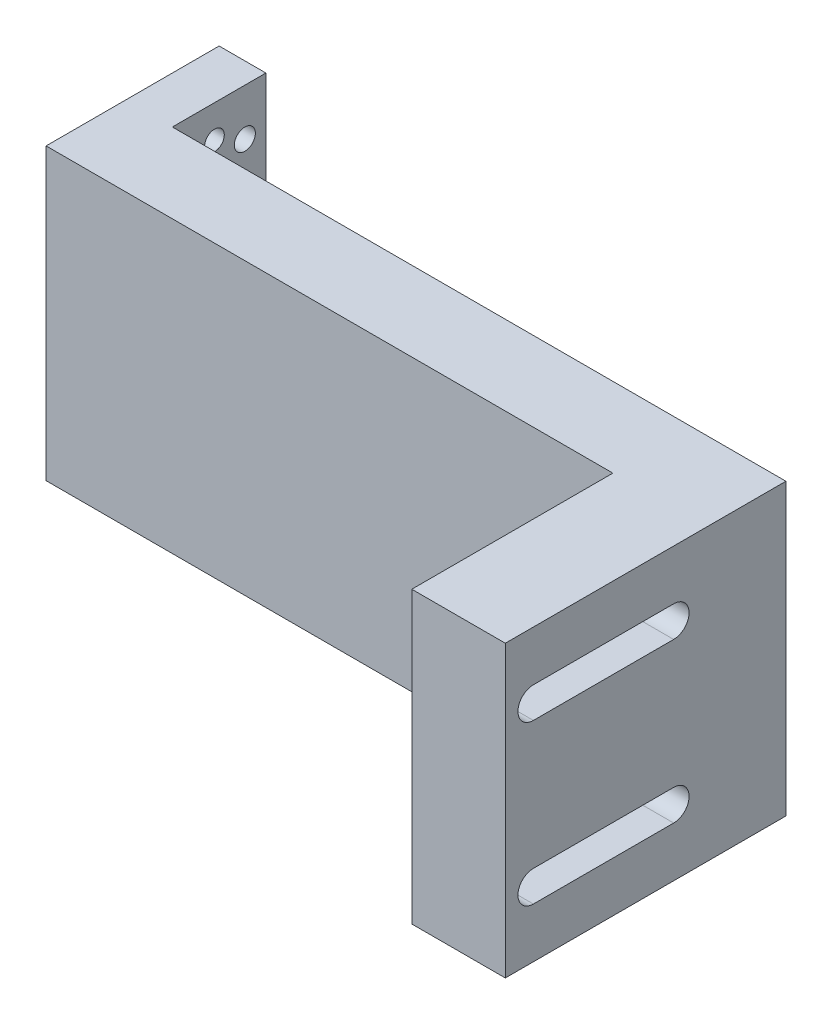
ISO-10303-21;
HEADER;
FILE_DESCRIPTION(('STEP AP214'),'2;1');
FILE_NAME('part.step','',(''),(''),'','','');
FILE_SCHEMA(('AUTOMOTIVE_DESIGN { 1 0 10303 214 1 1 1 1 }'));
ENDSEC;
DATA;
#1=APPLICATION_CONTEXT('core data for automotive mechanical design processes');
#2=APPLICATION_PROTOCOL_DEFINITION('international standard','automotive_design',2000,#1);
#3=PRODUCT_CONTEXT('',#1,'mechanical');
#4=PRODUCT('Part','Part','',(#3));
#5=PRODUCT_RELATED_PRODUCT_CATEGORY('part','',(#4));
#6=PRODUCT_DEFINITION_FORMATION('','',#4);
#7=PRODUCT_DEFINITION_CONTEXT('part definition',#1,'design');
#8=PRODUCT_DEFINITION('design','',#6,#7);
#9=PRODUCT_DEFINITION_SHAPE('','',#8);
#10=(LENGTH_UNIT() NAMED_UNIT(*) SI_UNIT(.MILLI.,.METRE.));
#11=(NAMED_UNIT(*) PLANE_ANGLE_UNIT() SI_UNIT($,.RADIAN.));
#12=(NAMED_UNIT(*) SI_UNIT($,.STERADIAN.) SOLID_ANGLE_UNIT());
#13=UNCERTAINTY_MEASURE_WITH_UNIT(LENGTH_MEASURE(1.E-05),#10,'distance_accuracy_value','');
#14=(GEOMETRIC_REPRESENTATION_CONTEXT(3) GLOBAL_UNCERTAINTY_ASSIGNED_CONTEXT((#13)) GLOBAL_UNIT_ASSIGNED_CONTEXT((#10,
#11,#12)) REPRESENTATION_CONTEXT('',''));
#15=CARTESIAN_POINT('',(0.,0.,0.));
#16=DIRECTION('',(0.,0.,1.));
#17=DIRECTION('',(1.,0.,0.));
#18=AXIS2_PLACEMENT_3D('',#15,#16,#17);
#19=CARTESIAN_POINT('',(0.,0.,80.));
#20=DIRECTION('',(1.,0.,0.));
#21=DIRECTION('',(0.,0.,-1.));
#22=AXIS2_PLACEMENT_3D('',#19,#20,#21);
#23=PLANE('',#22);
#24=CARTESIAN_POINT('',(0.,7.00000000000001,28.9999999999998));
#25=DIRECTION('',(-1.,0.,0.));
#26=DIRECTION('',(0.,0.,1.));
#27=AXIS2_PLACEMENT_3D('',#24,#25,#26);
#28=CIRCLE('',#27,2.09999999999999);
#29=CARTESIAN_POINT('',(0.,7.00000000000001,31.0999999999998));
#30=VERTEX_POINT('',#29);
#31=EDGE_CURVE('E164',#30,#30,#28,.T.);
#32=ORIENTED_EDGE('',*,*,#31,.F.);
#33=EDGE_LOOP('',(#32));
#34=FACE_BOUND('',#33,.T.);
#35=CARTESIAN_POINT('',(0.,7.00000000000001,10.9999999999998));
#36=DIRECTION('',(-1.,0.,0.));
#37=DIRECTION('',(0.,0.,1.));
#38=AXIS2_PLACEMENT_3D('',#35,#36,#37);
#39=CIRCLE('',#38,2.09999999999999);
#40=CARTESIAN_POINT('',(0.,7.00000000000001,13.0999999999998));
#41=VERTEX_POINT('',#40);
#42=EDGE_CURVE('E163',#41,#41,#39,.T.);
#43=ORIENTED_EDGE('',*,*,#42,.F.);
#44=EDGE_LOOP('',(#43));
#45=FACE_BOUND('',#44,.T.);
#46=CARTESIAN_POINT('',(0.,55.,10.9999999999998));
#47=DIRECTION('',(-1.,0.,0.));
#48=DIRECTION('',(0.,0.,1.));
#49=AXIS2_PLACEMENT_3D('',#46,#47,#48);
#50=CIRCLE('',#49,2.09999999999999);
#51=CARTESIAN_POINT('',(0.,55.,13.0999999999998));
#52=VERTEX_POINT('',#51);
#53=EDGE_CURVE('E171',#52,#52,#50,.T.);
#54=ORIENTED_EDGE('',*,*,#53,.F.);
#55=EDGE_LOOP('',(#54));
#56=FACE_BOUND('',#55,.T.);
#57=CARTESIAN_POINT('',(0.,55.,28.9999999999998));
#58=DIRECTION('',(-1.,0.,0.));
#59=DIRECTION('',(0.,0.,1.));
#60=AXIS2_PLACEMENT_3D('',#57,#58,#59);
#61=CIRCLE('',#60,2.09999999999999);
#62=CARTESIAN_POINT('',(0.,55.,31.0999999999998));
#63=VERTEX_POINT('',#62);
#64=EDGE_CURVE('E175',#63,#63,#61,.T.);
#65=ORIENTED_EDGE('',*,*,#64,.F.);
#66=EDGE_LOOP('',(#65));
#67=FACE_BOUND('',#66,.T.);
#68=CARTESIAN_POINT('',(0.,9.99999999999999,4.49999999999999));
#69=DIRECTION('',(1.,0.,0.));
#70=DIRECTION('',(0.,0.,1.));
#71=AXIS2_PLACEMENT_3D('',#68,#69,#70);
#72=CIRCLE('',#71,2.25);
#73=CARTESIAN_POINT('',(0.,9.99999999999999,6.74999999999999));
#74=VERTEX_POINT('',#73);
#75=EDGE_CURVE('E182',#74,#74,#72,.T.);
#76=ORIENTED_EDGE('',*,*,#75,.T.);
#77=EDGE_LOOP('',(#76));
#78=FACE_BOUND('',#77,.T.);
#79=CARTESIAN_POINT('',(0.,52.,4.5));
#80=DIRECTION('',(1.,0.,0.));
#81=DIRECTION('',(0.,0.,-1.));
#82=AXIS2_PLACEMENT_3D('',#79,#80,#81);
#83=CIRCLE('',#82,2.25);
#84=CARTESIAN_POINT('',(0.,52.,2.25));
#85=VERTEX_POINT('',#84);
#86=EDGE_CURVE('E188',#85,#85,#83,.T.);
#87=ORIENTED_EDGE('',*,*,#86,.T.);
#88=EDGE_LOOP('',(#87));
#89=FACE_BOUND('',#88,.T.);
#90=DIRECTION('',(0.,0.,-1.));
#91=VECTOR('',#90,1.);
#92=CARTESIAN_POINT('',(0.,0.,80.));
#93=LINE('',#92,#91);
#94=CARTESIAN_POINT('',(0.,0.,37.));
#95=VERTEX_POINT('',#94);
#96=CARTESIAN_POINT('',(0.,0.,0.));
#97=VERTEX_POINT('',#96);
#98=EDGE_CURVE('E11',#95,#97,#93,.T.);
#99=ORIENTED_EDGE('',*,*,#98,.F.);
#100=DIRECTION('',(0.,-1.,0.));
#101=VECTOR('',#100,1.);
#102=CARTESIAN_POINT('',(0.,62.,37.));
#103=LINE('',#102,#101);
#104=CARTESIAN_POINT('',(0.,62.,37.));
#105=VERTEX_POINT('',#104);
#106=EDGE_CURVE('E261',#105,#95,#103,.T.);
#107=ORIENTED_EDGE('',*,*,#106,.F.);
#108=DIRECTION('',(0.,0.,-1.));
#109=VECTOR('',#108,1.);
#110=CARTESIAN_POINT('',(0.,62.,80.));
#111=LINE('',#110,#109);
#112=CARTESIAN_POINT('',(0.,62.,0.));
#113=VERTEX_POINT('',#112);
#114=EDGE_CURVE('E298',#105,#113,#111,.T.);
#115=ORIENTED_EDGE('',*,*,#114,.T.);
#116=DIRECTION('',(0.,-1.,0.));
#117=VECTOR('',#116,1.);
#118=CARTESIAN_POINT('',(0.,0.,0.));
#119=LINE('',#118,#117);
#120=EDGE_CURVE('E285',#113,#97,#119,.T.);
#121=ORIENTED_EDGE('',*,*,#120,.T.);
#122=EDGE_LOOP('',(#99,#107,#115,#121));
#123=FACE_BOUND('',#122,.T.);
#124=ADVANCED_FACE('F35',(#34,#45,#56,#67,#78,#89,#123),#23,.F.);
#125=CARTESIAN_POINT('',(0.,0.,80.));
#126=DIRECTION('',(0.,1.,0.));
#127=DIRECTION('',(0.,0.,1.));
#128=AXIS2_PLACEMENT_3D('',#125,#126,#127);
#129=PLANE('',#128);
#130=DIRECTION('',(1.,0.,0.));
#131=VECTOR('',#130,1.);
#132=CARTESIAN_POINT('',(0.,0.,80.));
#133=LINE('',#132,#131);
#134=CARTESIAN_POINT('',(121.2,0.,80.));
#135=VERTEX_POINT('',#134);
#136=CARTESIAN_POINT('',(141.2,0.,80.));
#137=VERTEX_POINT('',#136);
#138=EDGE_CURVE('E290',#135,#137,#133,.T.);
#139=ORIENTED_EDGE('',*,*,#138,.F.);
#140=DIRECTION('',(0.,0.,1.));
#141=VECTOR('',#140,1.);
#142=CARTESIAN_POINT('',(121.2,0.,80.));
#143=LINE('',#142,#141);
#144=CARTESIAN_POINT('',(121.2,0.,37.));
#145=VERTEX_POINT('',#144);
#146=EDGE_CURVE('E258',#145,#135,#143,.T.);
#147=ORIENTED_EDGE('',*,*,#146,.F.);
#148=DIRECTION('',(1.,0.,0.));
#149=VECTOR('',#148,1.);
#150=CARTESIAN_POINT('',(0.,0.,37.));
#151=LINE('',#150,#149);
#152=EDGE_CURVE('E253',#95,#145,#151,.T.);
#153=ORIENTED_EDGE('',*,*,#152,.F.);
#154=ORIENTED_EDGE('',*,*,#98,.T.);
#155=DIRECTION('',(1.,0.,0.));
#156=VECTOR('',#155,1.);
#157=CARTESIAN_POINT('',(0.,0.,0.));
#158=LINE('',#157,#156);
#159=CARTESIAN_POINT('',(10.,0.,0.));
#160=VERTEX_POINT('',#159);
#161=EDGE_CURVE('E301',#97,#160,#158,.T.);
#162=ORIENTED_EDGE('',*,*,#161,.T.);
#163=DIRECTION('',(0.,0.,-1.));
#164=VECTOR('',#163,1.);
#165=CARTESIAN_POINT('',(10.,0.,0.));
#166=LINE('',#165,#164);
#167=CARTESIAN_POINT('',(10.,0.,20.));
#168=VERTEX_POINT('',#167);
#169=EDGE_CURVE('E268',#168,#160,#166,.T.);
#170=ORIENTED_EDGE('',*,*,#169,.F.);
#171=DIRECTION('',(-1.,0.,0.));
#172=VECTOR('',#171,1.);
#173=CARTESIAN_POINT('',(10.,0.,20.));
#174=LINE('',#173,#172);
#175=CARTESIAN_POINT('',(141.2,0.,20.));
#176=VERTEX_POINT('',#175);
#177=EDGE_CURVE('E276',#176,#168,#174,.T.);
#178=ORIENTED_EDGE('',*,*,#177,.F.);
#179=DIRECTION('',(0.,0.,-1.));
#180=VECTOR('',#179,1.);
#181=CARTESIAN_POINT('',(141.2,0.,80.));
#182=LINE('',#181,#180);
#183=EDGE_CURVE('E43',#137,#176,#182,.T.);
#184=ORIENTED_EDGE('',*,*,#183,.F.);
#185=EDGE_LOOP('',(#139,#147,#153,#154,#162,#170,#178,#184));
#186=FACE_BOUND('',#185,.T.);
#187=ADVANCED_FACE('F332',(#186),#129,.F.);
#188=CARTESIAN_POINT('',(141.2,0.,80.));
#189=DIRECTION('',(-1.,0.,0.));
#190=DIRECTION('',(0.,0.,1.));
#191=AXIS2_PLACEMENT_3D('',#188,#189,#190);
#192=PLANE('',#191);
#193=DIRECTION('',(0.,0.,-1.));
#194=VECTOR('',#193,1.);
#195=CARTESIAN_POINT('',(141.2,51.3,80.));
#196=LINE('',#195,#194);
#197=CARTESIAN_POINT('',(141.2,51.3,74.));
#198=VERTEX_POINT('',#197);
#199=CARTESIAN_POINT('',(141.2,51.3,44.));
#200=VERTEX_POINT('',#199);
#201=EDGE_CURVE('E215',#198,#200,#196,.T.);
#202=ORIENTED_EDGE('',*,*,#201,.T.);
#203=CARTESIAN_POINT('',(141.2,48.,44.));
#204=DIRECTION('',(-1.,0.,0.));
#205=DIRECTION('',(0.,0.,1.));
#206=AXIS2_PLACEMENT_3D('',#203,#204,#205);
#207=CIRCLE('',#206,3.3);
#208=CARTESIAN_POINT('',(141.2,44.7,44.));
#209=VERTEX_POINT('',#208);
#210=EDGE_CURVE('E218',#200,#209,#207,.T.);
#211=ORIENTED_EDGE('',*,*,#210,.T.);
#212=DIRECTION('',(0.,0.,1.));
#213=VECTOR('',#212,1.);
#214=CARTESIAN_POINT('',(141.2,44.7,80.));
#215=LINE('',#214,#213);
#216=CARTESIAN_POINT('',(141.2,44.7,74.));
#217=VERTEX_POINT('',#216);
#218=EDGE_CURVE('E205',#209,#217,#215,.T.);
#219=ORIENTED_EDGE('',*,*,#218,.T.);
#220=CARTESIAN_POINT('',(141.2,48.,74.));
#221=DIRECTION('',(-1.,0.,0.));
#222=DIRECTION('',(0.,0.,1.));
#223=AXIS2_PLACEMENT_3D('',#220,#221,#222);
#224=CIRCLE('',#223,3.3);
#225=EDGE_CURVE('E212',#217,#198,#224,.T.);
#226=ORIENTED_EDGE('',*,*,#225,.T.);
#227=EDGE_LOOP('',(#202,#211,#219,#226));
#228=FACE_BOUND('',#227,.T.);
#229=DIRECTION('',(0.,0.,-1.));
#230=VECTOR('',#229,1.);
#231=CARTESIAN_POINT('',(141.2,17.3,80.));
#232=LINE('',#231,#230);
#233=CARTESIAN_POINT('',(141.2,17.3,74.));
#234=VERTEX_POINT('',#233);
#235=CARTESIAN_POINT('',(141.2,17.3,44.));
#236=VERTEX_POINT('',#235);
#237=EDGE_CURVE('E247',#234,#236,#232,.T.);
#238=ORIENTED_EDGE('',*,*,#237,.T.);
#239=CARTESIAN_POINT('',(141.2,14.,44.));
#240=DIRECTION('',(-1.,0.,0.));
#241=DIRECTION('',(0.,0.,1.));
#242=AXIS2_PLACEMENT_3D('',#239,#240,#241);
#243=CIRCLE('',#242,3.3);
#244=CARTESIAN_POINT('',(141.2,10.7,44.));
#245=VERTEX_POINT('',#244);
#246=EDGE_CURVE('E250',#236,#245,#243,.T.);
#247=ORIENTED_EDGE('',*,*,#246,.T.);
#248=DIRECTION('',(0.,0.,1.));
#249=VECTOR('',#248,1.);
#250=CARTESIAN_POINT('',(141.2,10.7,80.));
#251=LINE('',#250,#249);
#252=CARTESIAN_POINT('',(141.2,10.7,74.));
#253=VERTEX_POINT('',#252);
#254=EDGE_CURVE('E235',#245,#253,#251,.T.);
#255=ORIENTED_EDGE('',*,*,#254,.T.);
#256=CARTESIAN_POINT('',(141.2,14.,74.));
#257=DIRECTION('',(-1.,0.,0.));
#258=DIRECTION('',(0.,0.,1.));
#259=AXIS2_PLACEMENT_3D('',#256,#257,#258);
#260=CIRCLE('',#259,3.3);
#261=EDGE_CURVE('E244',#253,#234,#260,.T.);
#262=ORIENTED_EDGE('',*,*,#261,.T.);
#263=EDGE_LOOP('',(#238,#247,#255,#262));
#264=FACE_BOUND('',#263,.T.);
#265=ORIENTED_EDGE('',*,*,#183,.T.);
#266=DIRECTION('',(0.,-1.,0.));
#267=VECTOR('',#266,1.);
#268=CARTESIAN_POINT('',(141.2,62.,20.));
#269=LINE('',#268,#267);
#270=CARTESIAN_POINT('',(141.2,62.,20.));
#271=VERTEX_POINT('',#270);
#272=EDGE_CURVE('E286',#271,#176,#269,.T.);
#273=ORIENTED_EDGE('',*,*,#272,.F.);
#274=DIRECTION('',(0.,0.,-1.));
#275=VECTOR('',#274,1.);
#276=CARTESIAN_POINT('',(141.2,62.,80.));
#277=LINE('',#276,#275);
#278=CARTESIAN_POINT('',(141.2,62.,80.));
#279=VERTEX_POINT('',#278);
#280=EDGE_CURVE('E307',#279,#271,#277,.T.);
#281=ORIENTED_EDGE('',*,*,#280,.F.);
#282=DIRECTION('',(0.,1.,0.));
#283=VECTOR('',#282,1.);
#284=CARTESIAN_POINT('',(141.2,0.,80.));
#285=LINE('',#284,#283);
#286=EDGE_CURVE('E292',#137,#279,#285,.T.);
#287=ORIENTED_EDGE('',*,*,#286,.F.);
#288=EDGE_LOOP('',(#265,#273,#281,#287));
#289=FACE_BOUND('',#288,.T.);
#290=ADVANCED_FACE('F339',(#228,#264,#289),#192,.F.);
#291=CARTESIAN_POINT('',(0.,62.,80.));
#292=DIRECTION('',(0.,-1.,0.));
#293=DIRECTION('',(0.,0.,-1.));
#294=AXIS2_PLACEMENT_3D('',#291,#292,#293);
#295=PLANE('',#294);
#296=DIRECTION('',(1.,0.,0.));
#297=VECTOR('',#296,1.);
#298=CARTESIAN_POINT('',(0.,62.,37.));
#299=LINE('',#298,#297);
#300=CARTESIAN_POINT('',(121.2,62.,37.));
#301=VERTEX_POINT('',#300);
#302=EDGE_CURVE('E254',#105,#301,#299,.T.);
#303=ORIENTED_EDGE('',*,*,#302,.T.);
#304=DIRECTION('',(0.,0.,1.));
#305=VECTOR('',#304,1.);
#306=CARTESIAN_POINT('',(121.2,62.,80.));
#307=LINE('',#306,#305);
#308=CARTESIAN_POINT('',(121.2,62.,80.));
#309=VERTEX_POINT('',#308);
#310=EDGE_CURVE('E257',#301,#309,#307,.T.);
#311=ORIENTED_EDGE('',*,*,#310,.T.);
#312=DIRECTION('',(-1.,0.,0.));
#313=VECTOR('',#312,1.);
#314=CARTESIAN_POINT('',(0.,62.,80.));
#315=LINE('',#314,#313);
#316=EDGE_CURVE('E295',#279,#309,#315,.T.);
#317=ORIENTED_EDGE('',*,*,#316,.F.);
#318=ORIENTED_EDGE('',*,*,#280,.T.);
#319=DIRECTION('',(-1.,0.,0.));
#320=VECTOR('',#319,1.);
#321=CARTESIAN_POINT('',(10.,62.,20.));
#322=LINE('',#321,#320);
#323=CARTESIAN_POINT('',(10.,62.,20.));
#324=VERTEX_POINT('',#323);
#325=EDGE_CURVE('E275',#271,#324,#322,.T.);
#326=ORIENTED_EDGE('',*,*,#325,.T.);
#327=DIRECTION('',(0.,0.,-1.));
#328=VECTOR('',#327,1.);
#329=CARTESIAN_POINT('',(10.,62.,0.));
#330=LINE('',#329,#328);
#331=CARTESIAN_POINT('',(10.,62.,0.));
#332=VERTEX_POINT('',#331);
#333=EDGE_CURVE('E272',#324,#332,#330,.T.);
#334=ORIENTED_EDGE('',*,*,#333,.T.);
#335=DIRECTION('',(-1.,0.,0.));
#336=VECTOR('',#335,1.);
#337=CARTESIAN_POINT('',(0.,62.,0.));
#338=LINE('',#337,#336);
#339=EDGE_CURVE('E293',#332,#113,#338,.T.);
#340=ORIENTED_EDGE('',*,*,#339,.T.);
#341=ORIENTED_EDGE('',*,*,#114,.F.);
#342=EDGE_LOOP('',(#303,#311,#317,#318,#326,#334,#340,#341));
#343=FACE_BOUND('',#342,.T.);
#344=ADVANCED_FACE('F368',(#343),#295,.F.);
#345=CARTESIAN_POINT('',(0.,62.,80.));
#346=DIRECTION('',(0.,0.,-1.));
#347=DIRECTION('',(-1.,0.,0.));
#348=AXIS2_PLACEMENT_3D('',#345,#346,#347);
#349=PLANE('',#348);
#350=ORIENTED_EDGE('',*,*,#316,.T.);
#351=DIRECTION('',(0.,-1.,0.));
#352=VECTOR('',#351,1.);
#353=CARTESIAN_POINT('',(121.2,62.,80.));
#354=LINE('',#353,#352);
#355=EDGE_CURVE('E265',#309,#135,#354,.T.);
#356=ORIENTED_EDGE('',*,*,#355,.T.);
#357=ORIENTED_EDGE('',*,*,#138,.T.);
#358=ORIENTED_EDGE('',*,*,#286,.T.);
#359=EDGE_LOOP('',(#350,#356,#357,#358));
#360=FACE_BOUND('',#359,.T.);
#361=ADVANCED_FACE('F379',(#360),#349,.F.);
#362=CARTESIAN_POINT('',(0.,62.,0.));
#363=DIRECTION('',(0.,0.,-1.));
#364=DIRECTION('',(-1.,0.,0.));
#365=AXIS2_PLACEMENT_3D('',#362,#363,#364);
#366=PLANE('',#365);
#367=DIRECTION('',(0.,-1.,0.));
#368=VECTOR('',#367,1.);
#369=CARTESIAN_POINT('',(10.,62.,0.));
#370=LINE('',#369,#368);
#371=EDGE_CURVE('E279',#332,#160,#370,.T.);
#372=ORIENTED_EDGE('',*,*,#371,.T.);
#373=ORIENTED_EDGE('',*,*,#161,.F.);
#374=ORIENTED_EDGE('',*,*,#120,.F.);
#375=ORIENTED_EDGE('',*,*,#339,.F.);
#376=EDGE_LOOP('',(#372,#373,#374,#375));
#377=FACE_BOUND('',#376,.T.);
#378=ADVANCED_FACE('F363',(#377),#366,.T.);
#379=CARTESIAN_POINT('',(10.,62.,0.));
#380=DIRECTION('',(-1.,0.,0.));
#381=DIRECTION('',(0.,0.,1.));
#382=AXIS2_PLACEMENT_3D('',#379,#380,#381);
#383=PLANE('',#382);
#384=CARTESIAN_POINT('',(10.,7.00000000000001,10.9999999999998));
#385=DIRECTION('',(-1.,0.,0.));
#386=DIRECTION('',(0.,0.,1.));
#387=AXIS2_PLACEMENT_3D('',#384,#385,#386);
#388=CIRCLE('',#387,2.09999999999999);
#389=CARTESIAN_POINT('',(10.,7.00000000000001,13.0999999999998));
#390=VERTEX_POINT('',#389);
#391=EDGE_CURVE('E38',#390,#390,#388,.T.);
#392=ORIENTED_EDGE('',*,*,#391,.T.);
#393=EDGE_LOOP('',(#392));
#394=FACE_BOUND('',#393,.T.);
#395=CARTESIAN_POINT('',(10.,55.,10.9999999999998));
#396=DIRECTION('',(-1.,0.,0.));
#397=DIRECTION('',(0.,0.,1.));
#398=AXIS2_PLACEMENT_3D('',#395,#396,#397);
#399=CIRCLE('',#398,2.09999999999999);
#400=CARTESIAN_POINT('',(10.,55.,13.0999999999998));
#401=VERTEX_POINT('',#400);
#402=EDGE_CURVE('E174',#401,#401,#399,.T.);
#403=ORIENTED_EDGE('',*,*,#402,.T.);
#404=EDGE_LOOP('',(#403));
#405=FACE_BOUND('',#404,.T.);
#406=CARTESIAN_POINT('',(10.,9.99999999999999,4.49999999999999));
#407=DIRECTION('',(1.,0.,0.));
#408=DIRECTION('',(0.,0.,1.));
#409=AXIS2_PLACEMENT_3D('',#406,#407,#408);
#410=CIRCLE('',#409,2.25);
#411=CARTESIAN_POINT('',(10.,9.99999999999999,6.74999999999999));
#412=VERTEX_POINT('',#411);
#413=EDGE_CURVE('E181',#412,#412,#410,.T.);
#414=ORIENTED_EDGE('',*,*,#413,.F.);
#415=EDGE_LOOP('',(#414));
#416=FACE_BOUND('',#415,.T.);
#417=CARTESIAN_POINT('',(10.,52.,4.5));
#418=DIRECTION('',(1.,0.,0.));
#419=DIRECTION('',(0.,0.,-1.));
#420=AXIS2_PLACEMENT_3D('',#417,#418,#419);
#421=CIRCLE('',#420,2.25);
#422=CARTESIAN_POINT('',(10.,52.,2.25));
#423=VERTEX_POINT('',#422);
#424=EDGE_CURVE('E185',#423,#423,#421,.T.);
#425=ORIENTED_EDGE('',*,*,#424,.F.);
#426=EDGE_LOOP('',(#425));
#427=FACE_BOUND('',#426,.T.);
#428=ORIENTED_EDGE('',*,*,#169,.T.);
#429=ORIENTED_EDGE('',*,*,#371,.F.);
#430=ORIENTED_EDGE('',*,*,#333,.F.);
#431=DIRECTION('',(0.,-1.,0.));
#432=VECTOR('',#431,1.);
#433=CARTESIAN_POINT('',(10.,62.,20.));
#434=LINE('',#433,#432);
#435=EDGE_CURVE('E283',#324,#168,#434,.T.);
#436=ORIENTED_EDGE('',*,*,#435,.T.);
#437=EDGE_LOOP('',(#428,#429,#430,#436));
#438=FACE_BOUND('',#437,.T.);
#439=ADVANCED_FACE('F314',(#394,#405,#416,#427,#438),#383,.F.);
#440=CARTESIAN_POINT('',(10.,62.,20.));
#441=DIRECTION('',(0.,0.,1.));
#442=DIRECTION('',(1.,0.,0.));
#443=AXIS2_PLACEMENT_3D('',#440,#441,#442);
#444=PLANE('',#443);
#445=ORIENTED_EDGE('',*,*,#177,.T.);
#446=ORIENTED_EDGE('',*,*,#435,.F.);
#447=ORIENTED_EDGE('',*,*,#325,.F.);
#448=ORIENTED_EDGE('',*,*,#272,.T.);
#449=EDGE_LOOP('',(#445,#446,#447,#448));
#450=FACE_BOUND('',#449,.T.);
#451=ADVANCED_FACE('F373',(#450),#444,.F.);
#452=CARTESIAN_POINT('',(121.2,62.,80.));
#453=DIRECTION('',(1.,0.,0.));
#454=DIRECTION('',(0.,0.,-1.));
#455=AXIS2_PLACEMENT_3D('',#452,#453,#454);
#456=PLANE('',#455);
#457=DIRECTION('',(0.,0.,1.));
#458=VECTOR('',#457,1.);
#459=CARTESIAN_POINT('',(121.2,44.7,44.));
#460=LINE('',#459,#458);
#461=CARTESIAN_POINT('',(121.2,44.7,44.));
#462=VERTEX_POINT('',#461);
#463=CARTESIAN_POINT('',(121.2,44.7,74.));
#464=VERTEX_POINT('',#463);
#465=EDGE_CURVE('E194',#462,#464,#460,.T.);
#466=ORIENTED_EDGE('',*,*,#465,.F.);
#467=CARTESIAN_POINT('',(121.2,48.,44.));
#468=DIRECTION('',(-1.,0.,0.));
#469=DIRECTION('',(0.,0.,-1.));
#470=AXIS2_PLACEMENT_3D('',#467,#468,#469);
#471=CIRCLE('',#470,3.3);
#472=CARTESIAN_POINT('',(121.2,51.3,44.));
#473=VERTEX_POINT('',#472);
#474=EDGE_CURVE('E59',#473,#462,#471,.T.);
#475=ORIENTED_EDGE('',*,*,#474,.F.);
#476=DIRECTION('',(0.,0.,-1.));
#477=VECTOR('',#476,1.);
#478=CARTESIAN_POINT('',(121.2,51.3,44.));
#479=LINE('',#478,#477);
#480=CARTESIAN_POINT('',(121.2,51.3,74.));
#481=VERTEX_POINT('',#480);
#482=EDGE_CURVE('E199',#481,#473,#479,.T.);
#483=ORIENTED_EDGE('',*,*,#482,.F.);
#484=CARTESIAN_POINT('',(121.2,48.,74.));
#485=DIRECTION('',(-1.,0.,0.));
#486=DIRECTION('',(0.,0.,-1.));
#487=AXIS2_PLACEMENT_3D('',#484,#485,#486);
#488=CIRCLE('',#487,3.3);
#489=EDGE_CURVE('E196',#464,#481,#488,.T.);
#490=ORIENTED_EDGE('',*,*,#489,.F.);
#491=EDGE_LOOP('',(#466,#475,#483,#490));
#492=FACE_BOUND('',#491,.T.);
#493=DIRECTION('',(0.,0.,1.));
#494=VECTOR('',#493,1.);
#495=CARTESIAN_POINT('',(121.2,10.7,44.));
#496=LINE('',#495,#494);
#497=CARTESIAN_POINT('',(121.2,10.7,44.));
#498=VERTEX_POINT('',#497);
#499=CARTESIAN_POINT('',(121.2,10.7,74.));
#500=VERTEX_POINT('',#499);
#501=EDGE_CURVE('E223',#498,#500,#496,.T.);
#502=ORIENTED_EDGE('',*,*,#501,.F.);
#503=CARTESIAN_POINT('',(121.2,14.,44.));
#504=DIRECTION('',(-1.,0.,0.));
#505=DIRECTION('',(0.,0.,1.));
#506=AXIS2_PLACEMENT_3D('',#503,#504,#505);
#507=CIRCLE('',#506,3.3);
#508=CARTESIAN_POINT('',(121.2,17.3,44.));
#509=VERTEX_POINT('',#508);
#510=EDGE_CURVE('E221',#509,#498,#507,.T.);
#511=ORIENTED_EDGE('',*,*,#510,.F.);
#512=DIRECTION('',(0.,0.,-1.));
#513=VECTOR('',#512,1.);
#514=CARTESIAN_POINT('',(121.2,17.3,44.));
#515=LINE('',#514,#513);
#516=CARTESIAN_POINT('',(121.2,17.3,74.));
#517=VERTEX_POINT('',#516);
#518=EDGE_CURVE('E229',#517,#509,#515,.T.);
#519=ORIENTED_EDGE('',*,*,#518,.F.);
#520=CARTESIAN_POINT('',(121.2,14.,74.));
#521=DIRECTION('',(-1.,0.,0.));
#522=DIRECTION('',(0.,0.,1.));
#523=AXIS2_PLACEMENT_3D('',#520,#521,#522);
#524=CIRCLE('',#523,3.3);
#525=EDGE_CURVE('E226',#500,#517,#524,.T.);
#526=ORIENTED_EDGE('',*,*,#525,.F.);
#527=EDGE_LOOP('',(#502,#511,#519,#526));
#528=FACE_BOUND('',#527,.T.);
#529=ORIENTED_EDGE('',*,*,#146,.T.);
#530=ORIENTED_EDGE('',*,*,#355,.F.);
#531=ORIENTED_EDGE('',*,*,#310,.F.);
#532=DIRECTION('',(0.,-1.,0.));
#533=VECTOR('',#532,1.);
#534=CARTESIAN_POINT('',(121.2,62.,37.));
#535=LINE('',#534,#533);
#536=EDGE_CURVE('E269',#301,#145,#535,.T.);
#537=ORIENTED_EDGE('',*,*,#536,.T.);
#538=EDGE_LOOP('',(#529,#530,#531,#537));
#539=FACE_BOUND('',#538,.T.);
#540=ADVANCED_FACE('F382',(#492,#528,#539),#456,.F.);
#541=CARTESIAN_POINT('',(0.,62.,37.));
#542=DIRECTION('',(0.,0.,-1.));
#543=DIRECTION('',(-1.,0.,0.));
#544=AXIS2_PLACEMENT_3D('',#541,#542,#543);
#545=PLANE('',#544);
#546=ORIENTED_EDGE('',*,*,#152,.T.);
#547=ORIENTED_EDGE('',*,*,#536,.F.);
#548=ORIENTED_EDGE('',*,*,#302,.F.);
#549=ORIENTED_EDGE('',*,*,#106,.T.);
#550=EDGE_LOOP('',(#546,#547,#548,#549));
#551=FACE_BOUND('',#550,.T.);
#552=ADVANCED_FACE('F384',(#551),#545,.F.);
#553=CARTESIAN_POINT('',(191.2,14.,44.));
#554=DIRECTION('',(-1.,0.,0.));
#555=DIRECTION('',(0.,0.,1.));
#556=AXIS2_PLACEMENT_3D('',#553,#554,#555);
#557=CYLINDRICAL_SURFACE('',#556,3.3);
#558=DIRECTION('',(-1.,0.,0.));
#559=VECTOR('',#558,1.);
#560=CARTESIAN_POINT('',(191.2,17.3,44.));
#561=LINE('',#560,#559);
#562=EDGE_CURVE('E233',#236,#509,#561,.T.);
#563=ORIENTED_EDGE('',*,*,#562,.T.);
#564=ORIENTED_EDGE('',*,*,#510,.T.);
#565=DIRECTION('',(-1.,0.,0.));
#566=VECTOR('',#565,1.);
#567=CARTESIAN_POINT('',(191.2,10.7,44.));
#568=LINE('',#567,#566);
#569=EDGE_CURVE('E232',#245,#498,#568,.T.);
#570=ORIENTED_EDGE('',*,*,#569,.F.);
#571=ORIENTED_EDGE('',*,*,#246,.F.);
#572=EDGE_LOOP('',(#563,#564,#570,#571));
#573=FACE_BOUND('',#572,.T.);
#574=ADVANCED_FACE('F386',(#573),#557,.F.);
#575=CARTESIAN_POINT('',(191.2,17.3,44.));
#576=DIRECTION('',(0.,1.,0.));
#577=DIRECTION('',(0.,0.,1.));
#578=AXIS2_PLACEMENT_3D('',#575,#576,#577);
#579=PLANE('',#578);
#580=DIRECTION('',(-1.,0.,0.));
#581=VECTOR('',#580,1.);
#582=CARTESIAN_POINT('',(191.2,17.3,74.));
#583=LINE('',#582,#581);
#584=EDGE_CURVE('E236',#234,#517,#583,.T.);
#585=ORIENTED_EDGE('',*,*,#584,.T.);
#586=ORIENTED_EDGE('',*,*,#518,.T.);
#587=ORIENTED_EDGE('',*,*,#562,.F.);
#588=ORIENTED_EDGE('',*,*,#237,.F.);
#589=EDGE_LOOP('',(#585,#586,#587,#588));
#590=FACE_BOUND('',#589,.T.);
#591=ADVANCED_FACE('F392',(#590),#579,.F.);
#592=CARTESIAN_POINT('',(191.2,14.,74.));
#593=DIRECTION('',(-1.,0.,0.));
#594=DIRECTION('',(0.,0.,1.));
#595=AXIS2_PLACEMENT_3D('',#592,#593,#594);
#596=CYLINDRICAL_SURFACE('',#595,3.3);
#597=DIRECTION('',(-1.,0.,0.));
#598=VECTOR('',#597,1.);
#599=CARTESIAN_POINT('',(191.2,10.7,74.));
#600=LINE('',#599,#598);
#601=EDGE_CURVE('E238',#253,#500,#600,.T.);
#602=ORIENTED_EDGE('',*,*,#601,.T.);
#603=ORIENTED_EDGE('',*,*,#525,.T.);
#604=ORIENTED_EDGE('',*,*,#584,.F.);
#605=ORIENTED_EDGE('',*,*,#261,.F.);
#606=EDGE_LOOP('',(#602,#603,#604,#605));
#607=FACE_BOUND('',#606,.T.);
#608=ADVANCED_FACE('F418',(#607),#596,.F.);
#609=CARTESIAN_POINT('',(191.2,10.7,44.));
#610=DIRECTION('',(0.,-1.,0.));
#611=DIRECTION('',(0.,0.,-1.));
#612=AXIS2_PLACEMENT_3D('',#609,#610,#611);
#613=PLANE('',#612);
#614=ORIENTED_EDGE('',*,*,#569,.T.);
#615=ORIENTED_EDGE('',*,*,#501,.T.);
#616=ORIENTED_EDGE('',*,*,#601,.F.);
#617=ORIENTED_EDGE('',*,*,#254,.F.);
#618=EDGE_LOOP('',(#614,#615,#616,#617));
#619=FACE_BOUND('',#618,.T.);
#620=ADVANCED_FACE('F426',(#619),#613,.F.);
#621=CARTESIAN_POINT('',(191.2,48.,44.));
#622=DIRECTION('',(-1.,0.,0.));
#623=DIRECTION('',(0.,0.,1.));
#624=AXIS2_PLACEMENT_3D('',#621,#622,#623);
#625=CYLINDRICAL_SURFACE('',#624,3.3);
#626=DIRECTION('',(-1.,0.,0.));
#627=VECTOR('',#626,1.);
#628=CARTESIAN_POINT('',(191.2,51.3,44.));
#629=LINE('',#628,#627);
#630=EDGE_CURVE('E203',#200,#473,#629,.T.);
#631=ORIENTED_EDGE('',*,*,#630,.T.);
#632=ORIENTED_EDGE('',*,*,#474,.T.);
#633=DIRECTION('',(-1.,0.,0.));
#634=VECTOR('',#633,1.);
#635=CARTESIAN_POINT('',(191.2,44.7,44.));
#636=LINE('',#635,#634);
#637=EDGE_CURVE('E202',#209,#462,#636,.T.);
#638=ORIENTED_EDGE('',*,*,#637,.F.);
#639=ORIENTED_EDGE('',*,*,#210,.F.);
#640=EDGE_LOOP('',(#631,#632,#638,#639));
#641=FACE_BOUND('',#640,.T.);
#642=ADVANCED_FACE('F428',(#641),#625,.F.);
#643=CARTESIAN_POINT('',(191.2,51.3,44.));
#644=DIRECTION('',(0.,1.,0.));
#645=DIRECTION('',(0.,0.,1.));
#646=AXIS2_PLACEMENT_3D('',#643,#644,#645);
#647=PLANE('',#646);
#648=DIRECTION('',(-1.,0.,0.));
#649=VECTOR('',#648,1.);
#650=CARTESIAN_POINT('',(191.2,51.3,74.));
#651=LINE('',#650,#649);
#652=EDGE_CURVE('E206',#198,#481,#651,.T.);
#653=ORIENTED_EDGE('',*,*,#652,.T.);
#654=ORIENTED_EDGE('',*,*,#482,.T.);
#655=ORIENTED_EDGE('',*,*,#630,.F.);
#656=ORIENTED_EDGE('',*,*,#201,.F.);
#657=EDGE_LOOP('',(#653,#654,#655,#656));
#658=FACE_BOUND('',#657,.T.);
#659=ADVANCED_FACE('F434',(#658),#647,.F.);
#660=CARTESIAN_POINT('',(191.2,48.,74.));
#661=DIRECTION('',(-1.,0.,0.));
#662=DIRECTION('',(0.,0.,1.));
#663=AXIS2_PLACEMENT_3D('',#660,#661,#662);
#664=CYLINDRICAL_SURFACE('',#663,3.3);
#665=DIRECTION('',(-1.,0.,0.));
#666=VECTOR('',#665,1.);
#667=CARTESIAN_POINT('',(191.2,44.7,74.));
#668=LINE('',#667,#666);
#669=EDGE_CURVE('E51',#217,#464,#668,.T.);
#670=ORIENTED_EDGE('',*,*,#669,.T.);
#671=ORIENTED_EDGE('',*,*,#489,.T.);
#672=ORIENTED_EDGE('',*,*,#652,.F.);
#673=ORIENTED_EDGE('',*,*,#225,.F.);
#674=EDGE_LOOP('',(#670,#671,#672,#673));
#675=FACE_BOUND('',#674,.T.);
#676=ADVANCED_FACE('F444',(#675),#664,.F.);
#677=CARTESIAN_POINT('',(191.2,44.7,44.));
#678=DIRECTION('',(0.,-1.,0.));
#679=DIRECTION('',(0.,0.,-1.));
#680=AXIS2_PLACEMENT_3D('',#677,#678,#679);
#681=PLANE('',#680);
#682=ORIENTED_EDGE('',*,*,#637,.T.);
#683=ORIENTED_EDGE('',*,*,#465,.T.);
#684=ORIENTED_EDGE('',*,*,#669,.F.);
#685=ORIENTED_EDGE('',*,*,#218,.F.);
#686=EDGE_LOOP('',(#682,#683,#684,#685));
#687=FACE_BOUND('',#686,.T.);
#688=ADVANCED_FACE('F440',(#687),#681,.F.);
#689=CARTESIAN_POINT('',(0.,52.,4.5));
#690=DIRECTION('',(1.,0.,0.));
#691=DIRECTION('',(0.,0.,-1.));
#692=AXIS2_PLACEMENT_3D('',#689,#690,#691);
#693=CYLINDRICAL_SURFACE('',#692,2.25);
#694=ORIENTED_EDGE('',*,*,#86,.F.);
#695=EDGE_LOOP('',(#694));
#696=FACE_BOUND('',#695,.T.);
#697=ORIENTED_EDGE('',*,*,#424,.T.);
#698=EDGE_LOOP('',(#697));
#699=FACE_BOUND('',#698,.T.);
#700=ADVANCED_FACE('F443',(#696,#699),#693,.F.);
#701=CARTESIAN_POINT('',(0.,9.99999999999999,4.49999999999999));
#702=DIRECTION('',(1.,0.,0.));
#703=DIRECTION('',(0.,0.,-1.));
#704=AXIS2_PLACEMENT_3D('',#701,#702,#703);
#705=CYLINDRICAL_SURFACE('',#704,2.25);
#706=ORIENTED_EDGE('',*,*,#75,.F.);
#707=EDGE_LOOP('',(#706));
#708=FACE_BOUND('',#707,.T.);
#709=ORIENTED_EDGE('',*,*,#413,.T.);
#710=EDGE_LOOP('',(#709));
#711=FACE_BOUND('',#710,.T.);
#712=ADVANCED_FACE('F453',(#708,#711),#705,.F.);
#713=CARTESIAN_POINT('',(12.4,55.,28.9999999999998));
#714=DIRECTION('',(-1.,0.,0.));
#715=DIRECTION('',(0.,0.,1.));
#716=AXIS2_PLACEMENT_3D('',#713,#714,#715);
#717=CONICAL_SURFACE('',#716,2.09999999999998,1.02974425867665);
#718=CARTESIAN_POINT('',(13.6618072999579,55.,28.9999999999998));
#719=VERTEX_POINT('',#718);
#720=VERTEX_LOOP('',#719);
#721=FACE_BOUND('',#720,.T.);
#722=CARTESIAN_POINT('',(12.4,55.,28.9999999999998));
#723=DIRECTION('',(-1.,0.,0.));
#724=DIRECTION('',(0.,0.,1.));
#725=AXIS2_PLACEMENT_3D('',#722,#723,#724);
#726=CIRCLE('',#725,2.09999999999998);
#727=CARTESIAN_POINT('',(12.4,55.,31.0999999999998));
#728=VERTEX_POINT('',#727);
#729=EDGE_CURVE('E178',#728,#728,#726,.T.);
#730=ORIENTED_EDGE('',*,*,#729,.T.);
#731=EDGE_LOOP('',(#730));
#732=FACE_BOUND('',#731,.T.);
#733=ADVANCED_FACE('F328',(#721,#732),#717,.F.);
#734=CARTESIAN_POINT('',(0.,55.,28.9999999999998));
#735=DIRECTION('',(-1.,0.,0.));
#736=DIRECTION('',(0.,0.,1.));
#737=AXIS2_PLACEMENT_3D('',#734,#735,#736);
#738=CYLINDRICAL_SURFACE('',#737,2.09999999999999);
#739=ORIENTED_EDGE('',*,*,#729,.F.);
#740=EDGE_LOOP('',(#739));
#741=FACE_BOUND('',#740,.T.);
#742=ORIENTED_EDGE('',*,*,#64,.T.);
#743=EDGE_LOOP('',(#742));
#744=FACE_BOUND('',#743,.T.);
#745=ADVANCED_FACE('F319',(#741,#744),#738,.F.);
#746=CARTESIAN_POINT('',(0.,55.,10.9999999999998));
#747=DIRECTION('',(-1.,0.,0.));
#748=DIRECTION('',(0.,0.,1.));
#749=AXIS2_PLACEMENT_3D('',#746,#747,#748);
#750=CYLINDRICAL_SURFACE('',#749,2.09999999999999);
#751=ORIENTED_EDGE('',*,*,#53,.T.);
#752=EDGE_LOOP('',(#751));
#753=FACE_BOUND('',#752,.T.);
#754=ORIENTED_EDGE('',*,*,#402,.F.);
#755=EDGE_LOOP('',(#754));
#756=FACE_BOUND('',#755,.T.);
#757=ADVANCED_FACE('F317',(#753,#756),#750,.F.);
#758=CARTESIAN_POINT('',(0.,7.00000000000001,10.9999999999998));
#759=DIRECTION('',(-1.,0.,0.));
#760=DIRECTION('',(0.,0.,1.));
#761=AXIS2_PLACEMENT_3D('',#758,#759,#760);
#762=CYLINDRICAL_SURFACE('',#761,2.09999999999999);
#763=ORIENTED_EDGE('',*,*,#42,.T.);
#764=EDGE_LOOP('',(#763));
#765=FACE_BOUND('',#764,.T.);
#766=ORIENTED_EDGE('',*,*,#391,.F.);
#767=EDGE_LOOP('',(#766));
#768=FACE_BOUND('',#767,.T.);
#769=ADVANCED_FACE('F157',(#765,#768),#762,.F.);
#770=CARTESIAN_POINT('',(12.4,7.00000000000001,28.9999999999998));
#771=DIRECTION('',(-1.,0.,0.));
#772=DIRECTION('',(0.,0.,1.));
#773=AXIS2_PLACEMENT_3D('',#770,#771,#772);
#774=CONICAL_SURFACE('',#773,2.09999999999999,1.02974425867665);
#775=CARTESIAN_POINT('',(13.6618072999579,7.00000000000001,28.9999999999998));
#776=VERTEX_POINT('',#775);
#777=VERTEX_LOOP('',#776);
#778=FACE_BOUND('',#777,.T.);
#779=CARTESIAN_POINT('',(12.4,7.00000000000001,28.9999999999998));
#780=DIRECTION('',(-1.,0.,0.));
#781=DIRECTION('',(0.,0.,1.));
#782=AXIS2_PLACEMENT_3D('',#779,#780,#781);
#783=CIRCLE('',#782,2.09999999999999);
#784=CARTESIAN_POINT('',(12.4,7.00000000000001,31.0999999999998));
#785=VERTEX_POINT('',#784);
#786=EDGE_CURVE('E161',#785,#785,#783,.T.);
#787=ORIENTED_EDGE('',*,*,#786,.T.);
#788=EDGE_LOOP('',(#787));
#789=FACE_BOUND('',#788,.T.);
#790=ADVANCED_FACE('F153',(#778,#789),#774,.F.);
#791=CARTESIAN_POINT('',(0.,7.00000000000001,28.9999999999998));
#792=DIRECTION('',(-1.,0.,0.));
#793=DIRECTION('',(0.,0.,1.));
#794=AXIS2_PLACEMENT_3D('',#791,#792,#793);
#795=CYLINDRICAL_SURFACE('',#794,2.09999999999999);
#796=ORIENTED_EDGE('',*,*,#786,.F.);
#797=EDGE_LOOP('',(#796));
#798=FACE_BOUND('',#797,.T.);
#799=ORIENTED_EDGE('',*,*,#31,.T.);
#800=EDGE_LOOP('',(#799));
#801=FACE_BOUND('',#800,.T.);
#802=ADVANCED_FACE('F156',(#798,#801),#795,.F.);
#803=CLOSED_SHELL('',(#124,#187,#290,#344,#361,#378,#439,#451,#540,#552,#574,#591,#608,#620,
#642,#659,#676,#688,#700,#712,#733,#745,#757,#769,#790,#802));
#804=MANIFOLD_SOLID_BREP('B2',#803);
#805=ADVANCED_BREP_SHAPE_REPRESENTATION('',(#18,#804),#14);
#806=SHAPE_DEFINITION_REPRESENTATION(#9,#805);
ENDSEC;
END-ISO-10303-21;
